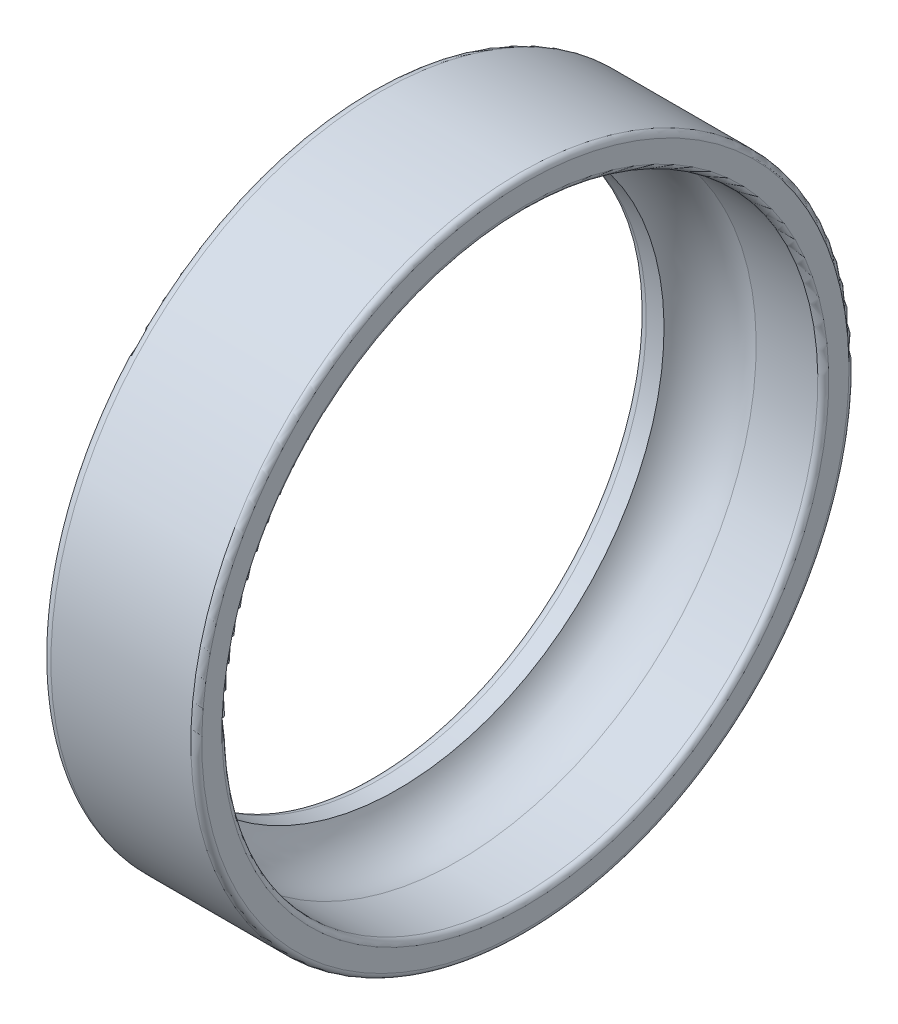
ISO-10303-21;
HEADER;
FILE_DESCRIPTION(('STEP AP214'),'2;1');
FILE_NAME('part.step','',(''),(''),'','','');
FILE_SCHEMA(('AUTOMOTIVE_DESIGN { 1 0 10303 214 1 1 1 1 }'));
ENDSEC;
DATA;
#1=APPLICATION_CONTEXT('core data for automotive mechanical design processes');
#2=APPLICATION_PROTOCOL_DEFINITION('international standard','automotive_design',2000,#1);
#3=PRODUCT_CONTEXT('',#1,'mechanical');
#4=PRODUCT('Part','Part','',(#3));
#5=PRODUCT_RELATED_PRODUCT_CATEGORY('part','',(#4));
#6=PRODUCT_DEFINITION_FORMATION('','',#4);
#7=PRODUCT_DEFINITION_CONTEXT('part definition',#1,'design');
#8=PRODUCT_DEFINITION('design','',#6,#7);
#9=PRODUCT_DEFINITION_SHAPE('','',#8);
#10=(LENGTH_UNIT() NAMED_UNIT(*) SI_UNIT(.MILLI.,.METRE.));
#11=(NAMED_UNIT(*) PLANE_ANGLE_UNIT() SI_UNIT($,.RADIAN.));
#12=(NAMED_UNIT(*) SI_UNIT($,.STERADIAN.) SOLID_ANGLE_UNIT());
#13=UNCERTAINTY_MEASURE_WITH_UNIT(LENGTH_MEASURE(1.E-05),#10,'distance_accuracy_value','');
#14=(GEOMETRIC_REPRESENTATION_CONTEXT(3) GLOBAL_UNCERTAINTY_ASSIGNED_CONTEXT((#13)) GLOBAL_UNIT_ASSIGNED_CONTEXT((#10,
#11,#12)) REPRESENTATION_CONTEXT('',''));
#15=CARTESIAN_POINT('',(0.,0.,0.));
#16=DIRECTION('',(0.,0.,1.));
#17=DIRECTION('',(1.,0.,0.));
#18=AXIS2_PLACEMENT_3D('',#15,#16,#17);
#19=CARTESIAN_POINT('',(2.07064183369056,0.,0.));
#20=DIRECTION('',(-1.,0.,0.));
#21=DIRECTION('',(0.,1.,0.));
#22=AXIS2_PLACEMENT_3D('',#19,#20,#21);
#23=CYLINDRICAL_SURFACE('',#22,29.125);
#24=CARTESIAN_POINT('',(3.04128366738113,0.,0.));
#25=DIRECTION('',(1.,0.,0.));
#26=DIRECTION('',(0.,1.,0.));
#27=AXIS2_PLACEMENT_3D('',#24,#25,#26);
#28=CIRCLE('',#27,29.125);
#29=CARTESIAN_POINT('',(3.04128366738113,29.125,0.));
#30=VERTEX_POINT('',#29);
#31=EDGE_CURVE('E10',#30,#30,#28,.T.);
#32=ORIENTED_EDGE('',*,*,#31,.T.);
#33=EDGE_LOOP('',(#32));
#34=FACE_BOUND('',#33,.T.);
#35=CARTESIAN_POINT('',(1.1,0.,0.));
#36=DIRECTION('',(1.,0.,0.));
#37=DIRECTION('',(0.,1.,0.));
#38=AXIS2_PLACEMENT_3D('',#35,#36,#37);
#39=CIRCLE('',#38,29.125);
#40=CARTESIAN_POINT('',(1.1,29.125,0.));
#41=VERTEX_POINT('',#40);
#42=EDGE_CURVE('E19',#41,#41,#39,.T.);
#43=ORIENTED_EDGE('',*,*,#42,.F.);
#44=EDGE_LOOP('',(#43));
#45=FACE_BOUND('',#44,.T.);
#46=ADVANCED_FACE('F15',(#34,#45),#23,.F.);
#47=CARTESIAN_POINT('',(8.5,0.,0.));
#48=DIRECTION('',(1.,0.,0.));
#49=DIRECTION('',(0.,0.,-1.));
#50=AXIS2_PLACEMENT_3D('',#47,#48,#49);
#51=TOROIDAL_SURFACE('',#50,26.75,5.953);
#52=CARTESIAN_POINT('',(9.65438685023701,0.,0.));
#53=DIRECTION('',(1.,0.,0.));
#54=DIRECTION('',(0.,1.,0.));
#55=AXIS2_PLACEMENT_3D('',#52,#53,#54);
#56=CIRCLE('',#55,32.59);
#57=CARTESIAN_POINT('',(9.65438685023701,32.59,0.));
#58=VERTEX_POINT('',#57);
#59=EDGE_CURVE('E25',#58,#58,#56,.T.);
#60=ORIENTED_EDGE('',*,*,#59,.T.);
#61=EDGE_LOOP('',(#60));
#62=FACE_BOUND('',#61,.T.);
#63=ORIENTED_EDGE('',*,*,#31,.F.);
#64=EDGE_LOOP('',(#63));
#65=FACE_BOUND('',#64,.T.);
#66=ADVANCED_FACE('F96',(#62,#65),#51,.F.);
#67=CARTESIAN_POINT('',(13.0271934251185,0.,0.));
#68=DIRECTION('',(-1.,0.,0.));
#69=DIRECTION('',(0.,1.,0.));
#70=AXIS2_PLACEMENT_3D('',#67,#68,#69);
#71=CYLINDRICAL_SURFACE('',#70,32.59);
#72=CARTESIAN_POINT('',(16.4,0.,0.));
#73=DIRECTION('',(1.,0.,0.));
#74=DIRECTION('',(0.,1.,0.));
#75=AXIS2_PLACEMENT_3D('',#72,#73,#74);
#76=CIRCLE('',#75,32.59);
#77=CARTESIAN_POINT('',(16.4,32.59,0.));
#78=VERTEX_POINT('',#77);
#79=EDGE_CURVE('E76',#78,#78,#76,.T.);
#80=ORIENTED_EDGE('',*,*,#79,.T.);
#81=EDGE_LOOP('',(#80));
#82=FACE_BOUND('',#81,.T.);
#83=ORIENTED_EDGE('',*,*,#59,.F.);
#84=EDGE_LOOP('',(#83));
#85=FACE_BOUND('',#84,.T.);
#86=ADVANCED_FACE('F101',(#82,#85),#71,.F.);
#87=CARTESIAN_POINT('',(16.4,0.,0.));
#88=DIRECTION('',(1.,0.,0.));
#89=DIRECTION('',(0.,0.,-1.));
#90=AXIS2_PLACEMENT_3D('',#87,#88,#89);
#91=TOROIDAL_SURFACE('',#90,33.19,0.6);
#92=CARTESIAN_POINT('',(17.,0.,0.));
#93=DIRECTION('',(1.,0.,0.));
#94=DIRECTION('',(0.,1.,0.));
#95=AXIS2_PLACEMENT_3D('',#92,#93,#94);
#96=CIRCLE('',#95,33.19);
#97=CARTESIAN_POINT('',(17.,33.19,0.));
#98=VERTEX_POINT('',#97);
#99=EDGE_CURVE('E75',#98,#98,#96,.T.);
#100=ORIENTED_EDGE('',*,*,#99,.T.);
#101=EDGE_LOOP('',(#100));
#102=FACE_BOUND('',#101,.T.);
#103=ORIENTED_EDGE('',*,*,#79,.F.);
#104=EDGE_LOOP('',(#103));
#105=FACE_BOUND('',#104,.T.);
#106=ADVANCED_FACE('F104',(#102,#105),#91,.T.);
#107=CARTESIAN_POINT('',(17.,34.295,0.));
#108=DIRECTION('',(1.,0.,0.));
#109=DIRECTION('',(0.,1.,0.));
#110=AXIS2_PLACEMENT_3D('',#107,#108,#109);
#111=PLANE('',#110);
#112=CARTESIAN_POINT('',(17.,0.,0.));
#113=DIRECTION('',(1.,0.,0.));
#114=DIRECTION('',(0.,1.,0.));
#115=AXIS2_PLACEMENT_3D('',#112,#113,#114);
#116=CIRCLE('',#115,35.4);
#117=CARTESIAN_POINT('',(17.,35.4,0.));
#118=VERTEX_POINT('',#117);
#119=EDGE_CURVE('E41',#118,#118,#116,.T.);
#120=ORIENTED_EDGE('',*,*,#119,.T.);
#121=EDGE_LOOP('',(#120));
#122=FACE_BOUND('',#121,.T.);
#123=ORIENTED_EDGE('',*,*,#99,.F.);
#124=EDGE_LOOP('',(#123));
#125=FACE_BOUND('',#124,.T.);
#126=ADVANCED_FACE('F106',(#122,#125),#111,.T.);
#127=CARTESIAN_POINT('',(16.4,0.,0.));
#128=DIRECTION('',(1.,0.,0.));
#129=DIRECTION('',(0.,0.,-1.));
#130=AXIS2_PLACEMENT_3D('',#127,#128,#129);
#131=TOROIDAL_SURFACE('',#130,35.4,0.6);
#132=CARTESIAN_POINT('',(16.4,0.,0.));
#133=DIRECTION('',(1.,0.,0.));
#134=DIRECTION('',(0.,1.,0.));
#135=AXIS2_PLACEMENT_3D('',#132,#133,#134);
#136=CIRCLE('',#135,36.);
#137=CARTESIAN_POINT('',(16.4,36.,0.));
#138=VERTEX_POINT('',#137);
#139=EDGE_CURVE('E48',#138,#138,#136,.T.);
#140=ORIENTED_EDGE('',*,*,#139,.T.);
#141=EDGE_LOOP('',(#140));
#142=FACE_BOUND('',#141,.T.);
#143=ORIENTED_EDGE('',*,*,#119,.F.);
#144=EDGE_LOOP('',(#143));
#145=FACE_BOUND('',#144,.T.);
#146=ADVANCED_FACE('F112',(#142,#145),#131,.T.);
#147=CARTESIAN_POINT('',(8.75,0.,0.));
#148=DIRECTION('',(-1.,0.,0.));
#149=DIRECTION('',(0.,1.,0.));
#150=AXIS2_PLACEMENT_3D('',#147,#148,#149);
#151=CYLINDRICAL_SURFACE('',#150,36.);
#152=CARTESIAN_POINT('',(1.1,0.,0.));
#153=DIRECTION('',(1.,0.,0.));
#154=DIRECTION('',(0.,1.,0.));
#155=AXIS2_PLACEMENT_3D('',#152,#153,#154);
#156=CIRCLE('',#155,36.);
#157=CARTESIAN_POINT('',(1.1,36.,0.));
#158=VERTEX_POINT('',#157);
#159=EDGE_CURVE('E68',#158,#158,#156,.T.);
#160=ORIENTED_EDGE('',*,*,#159,.T.);
#161=EDGE_LOOP('',(#160));
#162=FACE_BOUND('',#161,.T.);
#163=ORIENTED_EDGE('',*,*,#139,.F.);
#164=EDGE_LOOP('',(#163));
#165=FACE_BOUND('',#164,.T.);
#166=ADVANCED_FACE('F155',(#162,#165),#151,.T.);
#167=CARTESIAN_POINT('',(1.1,0.,0.));
#168=DIRECTION('',(1.,0.,0.));
#169=DIRECTION('',(0.,0.,-1.));
#170=AXIS2_PLACEMENT_3D('',#167,#168,#169);
#171=TOROIDAL_SURFACE('',#170,34.9,1.1);
#172=CARTESIAN_POINT('',(0.,0.,0.));
#173=DIRECTION('',(1.,0.,0.));
#174=DIRECTION('',(0.,1.,0.));
#175=AXIS2_PLACEMENT_3D('',#172,#173,#174);
#176=CIRCLE('',#175,34.9);
#177=CARTESIAN_POINT('',(0.,34.9,0.));
#178=VERTEX_POINT('',#177);
#179=EDGE_CURVE('E64',#178,#178,#176,.T.);
#180=ORIENTED_EDGE('',*,*,#179,.T.);
#181=EDGE_LOOP('',(#180));
#182=FACE_BOUND('',#181,.T.);
#183=ORIENTED_EDGE('',*,*,#159,.F.);
#184=EDGE_LOOP('',(#183));
#185=FACE_BOUND('',#184,.T.);
#186=ADVANCED_FACE('F65',(#182,#185),#171,.T.);
#187=CARTESIAN_POINT('',(0.,32.5625,0.));
#188=DIRECTION('',(-1.,0.,0.));
#189=DIRECTION('',(0.,-1.,0.));
#190=AXIS2_PLACEMENT_3D('',#187,#188,#189);
#191=PLANE('',#190);
#192=CARTESIAN_POINT('',(0.,0.,0.));
#193=DIRECTION('',(1.,0.,0.));
#194=DIRECTION('',(0.,1.,0.));
#195=AXIS2_PLACEMENT_3D('',#192,#193,#194);
#196=CIRCLE('',#195,30.225);
#197=CARTESIAN_POINT('',(0.,30.225,0.));
#198=VERTEX_POINT('',#197);
#199=EDGE_CURVE('E71',#198,#198,#196,.T.);
#200=ORIENTED_EDGE('',*,*,#199,.T.);
#201=EDGE_LOOP('',(#200));
#202=FACE_BOUND('',#201,.T.);
#203=ORIENTED_EDGE('',*,*,#179,.F.);
#204=EDGE_LOOP('',(#203));
#205=FACE_BOUND('',#204,.T.);
#206=ADVANCED_FACE('F17',(#202,#205),#191,.T.);
#207=CARTESIAN_POINT('',(1.1,0.,0.));
#208=DIRECTION('',(1.,0.,0.));
#209=DIRECTION('',(0.,0.,-1.));
#210=AXIS2_PLACEMENT_3D('',#207,#208,#209);
#211=TOROIDAL_SURFACE('',#210,30.225,1.1);
#212=ORIENTED_EDGE('',*,*,#42,.T.);
#213=EDGE_LOOP('',(#212));
#214=FACE_BOUND('',#213,.T.);
#215=ORIENTED_EDGE('',*,*,#199,.F.);
#216=EDGE_LOOP('',(#215));
#217=FACE_BOUND('',#216,.T.);
#218=ADVANCED_FACE('F86',(#214,#217),#211,.T.);
#219=CLOSED_SHELL('',(#46,#66,#86,#106,#126,#146,#166,#186,#206,#218));
#220=MANIFOLD_SOLID_BREP('B1',#219);
#221=ADVANCED_BREP_SHAPE_REPRESENTATION('',(#18,#220),#14);
#222=SHAPE_DEFINITION_REPRESENTATION(#9,#221);
ENDSEC;
END-ISO-10303-21;
